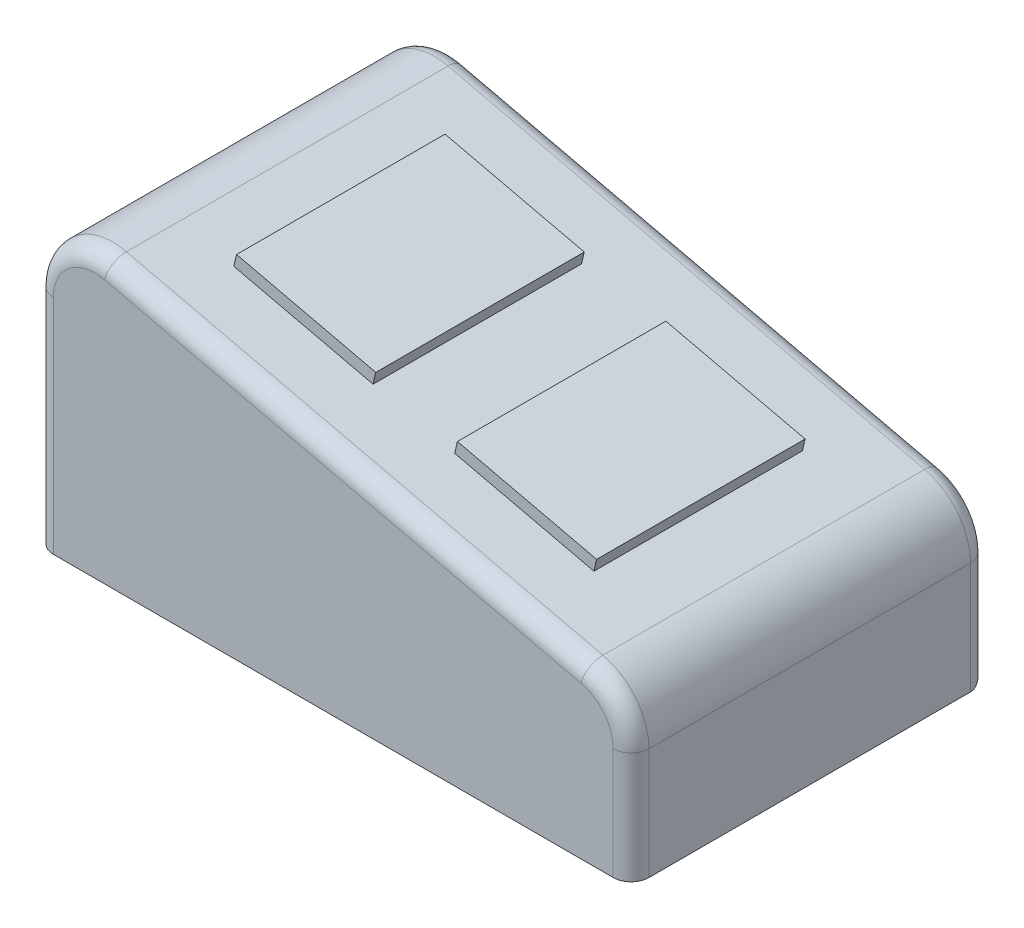
ISO-10303-21;
HEADER;
FILE_DESCRIPTION(('STEP AP214'),'2;1');
FILE_NAME('part.step','',(''),(''),'','','');
FILE_SCHEMA(('AUTOMOTIVE_DESIGN { 1 0 10303 214 1 1 1 1 }'));
ENDSEC;
DATA;
#1=APPLICATION_CONTEXT('core data for automotive mechanical design processes');
#2=APPLICATION_PROTOCOL_DEFINITION('international standard','automotive_design',2000,#1);
#3=PRODUCT_CONTEXT('',#1,'mechanical');
#4=PRODUCT('Part','Part','',(#3));
#5=PRODUCT_RELATED_PRODUCT_CATEGORY('part','',(#4));
#6=PRODUCT_DEFINITION_FORMATION('','',#4);
#7=PRODUCT_DEFINITION_CONTEXT('part definition',#1,'design');
#8=PRODUCT_DEFINITION('design','',#6,#7);
#9=PRODUCT_DEFINITION_SHAPE('','',#8);
#10=(LENGTH_UNIT() NAMED_UNIT(*) SI_UNIT(.MILLI.,.METRE.));
#11=(NAMED_UNIT(*) PLANE_ANGLE_UNIT() SI_UNIT($,.RADIAN.));
#12=(NAMED_UNIT(*) SI_UNIT($,.STERADIAN.) SOLID_ANGLE_UNIT());
#13=UNCERTAINTY_MEASURE_WITH_UNIT(LENGTH_MEASURE(1.E-05),#10,'distance_accuracy_value','');
#14=(GEOMETRIC_REPRESENTATION_CONTEXT(3) GLOBAL_UNCERTAINTY_ASSIGNED_CONTEXT((#13)) GLOBAL_UNIT_ASSIGNED_CONTEXT((#10,
#11,#12)) REPRESENTATION_CONTEXT('',''));
#15=CARTESIAN_POINT('',(0.,0.,0.));
#16=DIRECTION('',(0.,0.,1.));
#17=DIRECTION('',(1.,0.,0.));
#18=AXIS2_PLACEMENT_3D('',#15,#16,#17);
#19=CARTESIAN_POINT('',(-54.7441180352743,4.20563201299211,-60.));
#20=DIRECTION('',(0.227158877100831,0.973857712684091,0.));
#21=DIRECTION('',(-0.973857712684091,0.227158877100831,0.));
#22=AXIS2_PLACEMENT_3D('',#19,#20,#21);
#23=PLANE('',#22);
#24=DIRECTION('',(0.,0.,1.));
#25=VECTOR('',#24,1.);
#26=CARTESIAN_POINT('',(-54.7441180352743,4.20563201299211,-60.));
#27=LINE('',#26,#25);
#28=CARTESIAN_POINT('',(-54.7441180352743,4.20563201299211,-57.));
#29=VERTEX_POINT('',#28);
#30=CARTESIAN_POINT('',(-54.7441180352743,4.20563201299211,-3.));
#31=VERTEX_POINT('',#30);
#32=EDGE_CURVE('E246',#29,#31,#27,.T.);
#33=ORIENTED_EDGE('',*,*,#32,.T.);
#34=DIRECTION('',(-0.973857712684091,0.227158877100831,0.));
#35=VECTOR('',#34,1.);
#36=CARTESIAN_POINT('',(-54.7441180352743,4.20563201299211,-3.));
#37=LINE('',#36,#35);
#38=CARTESIAN_POINT('',(25.2558819647255,-14.454907336211,-3.));
#39=VERTEX_POINT('',#38);
#40=EDGE_CURVE('E280',#31,#39,#37,.F.);
#41=ORIENTED_EDGE('',*,*,#40,.T.);
#42=DIRECTION('',(0.,0.,1.));
#43=VECTOR('',#42,1.);
#44=CARTESIAN_POINT('',(25.2558819647255,-14.454907336211,-60.));
#45=LINE('',#44,#43);
#46=CARTESIAN_POINT('',(25.2558819647255,-14.454907336211,-57.));
#47=VERTEX_POINT('',#46);
#48=EDGE_CURVE('E249',#47,#39,#45,.T.);
#49=ORIENTED_EDGE('',*,*,#48,.F.);
#50=DIRECTION('',(-0.973857712684091,0.227158877100831,0.));
#51=VECTOR('',#50,1.);
#52=CARTESIAN_POINT('',(-54.7441180352743,4.20563201299211,-57.));
#53=LINE('',#52,#51);
#54=EDGE_CURVE('E278',#47,#29,#53,.T.);
#55=ORIENTED_EDGE('',*,*,#54,.T.);
#56=EDGE_LOOP('',(#33,#41,#49,#55));
#57=FACE_BOUND('',#56,.T.);
#58=DIRECTION('',(0.973857712684091,-0.227158877100831,0.));
#59=VECTOR('',#58,1.);
#60=CARTESIAN_POINT('',(-45.7103974646014,2.09845578575776,-12.));
#61=LINE('',#60,#59);
#62=CARTESIAN_POINT('',(-45.7103974646014,2.09845578575776,-12.));
#63=VERTEX_POINT('',#62);
#64=CARTESIAN_POINT('',(-22.3378123601832,-3.35335726466218,-12.));
#65=VERTEX_POINT('',#64);
#66=EDGE_CURVE('E201',#63,#65,#61,.T.);
#67=ORIENTED_EDGE('',*,*,#66,.F.);
#68=DIRECTION('',(0.,0.,1.));
#69=VECTOR('',#68,1.);
#70=CARTESIAN_POINT('',(-45.7103974646014,2.09845578575776,-47.));
#71=LINE('',#70,#69);
#72=CARTESIAN_POINT('',(-45.7103974646014,2.09845578575776,-47.));
#73=VERTEX_POINT('',#72);
#74=EDGE_CURVE('E198',#73,#63,#71,.T.);
#75=ORIENTED_EDGE('',*,*,#74,.F.);
#76=DIRECTION('',(-0.973857712684091,0.227158877100831,0.));
#77=VECTOR('',#76,1.);
#78=CARTESIAN_POINT('',(-45.7103974646014,2.09845578575776,-47.));
#79=LINE('',#78,#77);
#80=CARTESIAN_POINT('',(-22.3378123601832,-3.35335726466218,-47.));
#81=VERTEX_POINT('',#80);
#82=EDGE_CURVE('E211',#81,#73,#79,.T.);
#83=ORIENTED_EDGE('',*,*,#82,.F.);
#84=DIRECTION('',(0.,0.,-1.));
#85=VECTOR('',#84,1.);
#86=CARTESIAN_POINT('',(-22.3378123601832,-3.35335726466218,-47.));
#87=LINE('',#86,#85);
#88=EDGE_CURVE('E219',#65,#81,#87,.T.);
#89=ORIENTED_EDGE('',*,*,#88,.F.);
#90=EDGE_LOOP('',(#67,#75,#83,#89));
#91=FACE_BOUND('',#90,.T.);
#92=DIRECTION('',(0.973857712684091,-0.227158877100831,0.));
#93=VECTOR('',#92,1.);
#94=CARTESIAN_POINT('',(-8.62951617908137,-6.55090976838696,-12.));
#95=LINE('',#94,#93);
#96=CARTESIAN_POINT('',(-8.62951617908137,-6.55090976838696,-12.));
#97=VERTEX_POINT('',#96);
#98=CARTESIAN_POINT('',(14.7430689253368,-12.0027228188069,-12.));
#99=VERTEX_POINT('',#98);
#100=EDGE_CURVE('E655',#97,#99,#95,.T.);
#101=ORIENTED_EDGE('',*,*,#100,.F.);
#102=DIRECTION('',(0.,0.,1.));
#103=VECTOR('',#102,1.);
#104=CARTESIAN_POINT('',(-8.62951617908137,-6.55090976838696,-47.));
#105=LINE('',#104,#103);
#106=CARTESIAN_POINT('',(-8.62951617908137,-6.55090976838696,-47.));
#107=VERTEX_POINT('',#106);
#108=EDGE_CURVE('E196',#107,#97,#105,.T.);
#109=ORIENTED_EDGE('',*,*,#108,.F.);
#110=DIRECTION('',(-0.973857712684091,0.227158877100831,0.));
#111=VECTOR('',#110,1.);
#112=CARTESIAN_POINT('',(-8.62951617908137,-6.55090976838696,-47.));
#113=LINE('',#112,#111);
#114=CARTESIAN_POINT('',(14.7430689253368,-12.0027228188069,-47.));
#115=VERTEX_POINT('',#114);
#116=EDGE_CURVE('E192',#115,#107,#113,.T.);
#117=ORIENTED_EDGE('',*,*,#116,.F.);
#118=DIRECTION('',(0.,0.,-1.));
#119=VECTOR('',#118,1.);
#120=CARTESIAN_POINT('',(14.7430689253368,-12.0027228188069,-47.));
#121=LINE('',#120,#119);
#122=EDGE_CURVE('E658',#99,#115,#121,.T.);
#123=ORIENTED_EDGE('',*,*,#122,.F.);
#124=EDGE_LOOP('',(#101,#109,#117,#123));
#125=FACE_BOUND('',#124,.T.);
#126=ADVANCED_FACE('F35',(#57,#91,#125),#23,.T.);
#127=CARTESIAN_POINT('',(32.9842931937173,-24.193484463052,-60.));
#128=DIRECTION('',(1.,0.,0.));
#129=DIRECTION('',(0.,1.,0.));
#130=AXIS2_PLACEMENT_3D('',#127,#128,#129);
#131=PLANE('',#130);
#132=DIRECTION('',(0.,0.,1.));
#133=VECTOR('',#132,1.);
#134=CARTESIAN_POINT('',(32.9842931937173,-42.9319371727749,-60.));
#135=LINE('',#134,#133);
#136=CARTESIAN_POINT('',(32.9842931937173,-42.9319371727749,-57.));
#137=VERTEX_POINT('',#136);
#138=CARTESIAN_POINT('',(32.9842931937173,-42.9319371727749,-3.));
#139=VERTEX_POINT('',#138);
#140=EDGE_CURVE('E236',#137,#139,#135,.T.);
#141=ORIENTED_EDGE('',*,*,#140,.F.);
#142=DIRECTION('',(0.,1.,0.));
#143=VECTOR('',#142,1.);
#144=CARTESIAN_POINT('',(32.9842931937173,-24.193484463052,-57.));
#145=LINE('',#144,#143);
#146=CARTESIAN_POINT('',(32.9842931937173,-24.193484463052,-57.));
#147=VERTEX_POINT('',#146);
#148=EDGE_CURVE('E11',#137,#147,#145,.T.);
#149=ORIENTED_EDGE('',*,*,#148,.T.);
#150=DIRECTION('',(0.,0.,1.));
#151=VECTOR('',#150,1.);
#152=CARTESIAN_POINT('',(32.9842931937173,-24.193484463052,-60.));
#153=LINE('',#152,#151);
#154=CARTESIAN_POINT('',(32.9842931937173,-24.193484463052,-3.));
#155=VERTEX_POINT('',#154);
#156=EDGE_CURVE('E235',#147,#155,#153,.T.);
#157=ORIENTED_EDGE('',*,*,#156,.T.);
#158=DIRECTION('',(0.,1.,0.));
#159=VECTOR('',#158,1.);
#160=CARTESIAN_POINT('',(32.9842931937173,-24.193484463052,-3.));
#161=LINE('',#160,#159);
#162=EDGE_CURVE('E44',#155,#139,#161,.F.);
#163=ORIENTED_EDGE('',*,*,#162,.T.);
#164=EDGE_LOOP('',(#141,#149,#157,#163));
#165=FACE_BOUND('',#164,.T.);
#166=ADVANCED_FACE('F344',(#165),#131,.T.);
#167=CARTESIAN_POINT('',(-67.0157068062827,-42.9319371727749,-60.));
#168=DIRECTION('',(0.,-1.,0.));
#169=DIRECTION('',(0.,0.,-1.));
#170=AXIS2_PLACEMENT_3D('',#167,#168,#169);
#171=PLANE('',#170);
#172=DIRECTION('',(1.,0.,0.));
#173=VECTOR('',#172,1.);
#174=CARTESIAN_POINT('',(-67.0157068062827,-42.9319371727749,0.));
#175=LINE('',#174,#173);
#176=CARTESIAN_POINT('',(-64.0157068062827,-42.9319371727749,0.));
#177=VERTEX_POINT('',#176);
#178=CARTESIAN_POINT('',(29.9842931937173,-42.9319371727749,0.));
#179=VERTEX_POINT('',#178);
#180=EDGE_CURVE('E232',#177,#179,#175,.T.);
#181=ORIENTED_EDGE('',*,*,#180,.F.);
#182=CARTESIAN_POINT('',(-64.0157068062827,-42.9319371727749,-3.));
#183=DIRECTION('',(0.,-1.,0.));
#184=DIRECTION('',(0.,0.,-1.));
#185=AXIS2_PLACEMENT_3D('',#182,#183,#184);
#186=CIRCLE('',#185,3.);
#187=CARTESIAN_POINT('',(-67.0157068062827,-42.9319371727749,-3.));
#188=VERTEX_POINT('',#187);
#189=EDGE_CURVE('E268',#177,#188,#186,.T.);
#190=ORIENTED_EDGE('',*,*,#189,.T.);
#191=DIRECTION('',(0.,0.,1.));
#192=VECTOR('',#191,1.);
#193=CARTESIAN_POINT('',(-67.0157068062827,-42.9319371727749,-60.));
#194=LINE('',#193,#192);
#195=CARTESIAN_POINT('',(-67.0157068062827,-42.9319371727749,-57.));
#196=VERTEX_POINT('',#195);
#197=EDGE_CURVE('E240',#196,#188,#194,.T.);
#198=ORIENTED_EDGE('',*,*,#197,.F.);
#199=DIRECTION('',(1.,0.,0.));
#200=VECTOR('',#199,1.);
#201=CARTESIAN_POINT('',(32.9842931937173,-42.9319371727749,-57.));
#202=LINE('',#201,#200);
#203=EDGE_CURVE('E266',#196,#137,#202,.T.);
#204=ORIENTED_EDGE('',*,*,#203,.T.);
#205=ORIENTED_EDGE('',*,*,#140,.T.);
#206=CARTESIAN_POINT('',(29.9842931937173,-42.9319371727749,-3.));
#207=DIRECTION('',(0.,-1.,0.));
#208=DIRECTION('',(0.,0.,-1.));
#209=AXIS2_PLACEMENT_3D('',#206,#207,#208);
#210=CIRCLE('',#209,3.);
#211=EDGE_CURVE('E264',#139,#179,#210,.T.);
#212=ORIENTED_EDGE('',*,*,#211,.T.);
#213=EDGE_LOOP('',(#181,#190,#198,#204,#205,#212));
#214=FACE_BOUND('',#213,.T.);
#215=ADVANCED_FACE('F370',(#214),#171,.T.);
#216=CARTESIAN_POINT('',(-67.0157068062827,-5.53294511384887,-60.));
#217=DIRECTION('',(-1.,0.,0.));
#218=DIRECTION('',(0.,-1.,0.));
#219=AXIS2_PLACEMENT_3D('',#216,#217,#218);
#220=PLANE('',#219);
#221=ORIENTED_EDGE('',*,*,#197,.T.);
#222=DIRECTION('',(0.,-1.,0.));
#223=VECTOR('',#222,1.);
#224=CARTESIAN_POINT('',(-67.0157068062827,-5.53294511384887,-3.));
#225=LINE('',#224,#223);
#226=CARTESIAN_POINT('',(-67.0157068062827,-5.53294511384887,-3.));
#227=VERTEX_POINT('',#226);
#228=EDGE_CURVE('E272',#188,#227,#225,.F.);
#229=ORIENTED_EDGE('',*,*,#228,.T.);
#230=DIRECTION('',(0.,0.,1.));
#231=VECTOR('',#230,1.);
#232=CARTESIAN_POINT('',(-67.0157068062827,-5.53294511384887,-60.));
#233=LINE('',#232,#231);
#234=CARTESIAN_POINT('',(-67.0157068062827,-5.53294511384887,-57.));
#235=VERTEX_POINT('',#234);
#236=EDGE_CURVE('E243',#235,#227,#233,.T.);
#237=ORIENTED_EDGE('',*,*,#236,.F.);
#238=DIRECTION('',(0.,-1.,0.));
#239=VECTOR('',#238,1.);
#240=CARTESIAN_POINT('',(-67.0157068062827,-42.9319371727749,-57.));
#241=LINE('',#240,#239);
#242=EDGE_CURVE('E270',#235,#196,#241,.T.);
#243=ORIENTED_EDGE('',*,*,#242,.T.);
#244=EDGE_LOOP('',(#221,#229,#237,#243));
#245=FACE_BOUND('',#244,.T.);
#246=ADVANCED_FACE('F374',(#245),#220,.T.);
#247=CARTESIAN_POINT('',(-57.0157068062827,-5.53294511384879,-60.));
#248=DIRECTION('',(0.,0.,1.));
#249=DIRECTION('',(1.,0.,0.));
#250=AXIS2_PLACEMENT_3D('',#247,#248,#249);
#251=CYLINDRICAL_SURFACE('',#250,10.);
#252=ORIENTED_EDGE('',*,*,#236,.T.);
#253=CARTESIAN_POINT('',(-57.0157068062827,-5.53294511384879,-3.));
#254=DIRECTION('',(0.,0.,1.));
#255=DIRECTION('',(1.,0.,0.));
#256=AXIS2_PLACEMENT_3D('',#253,#254,#255);
#257=CIRCLE('',#256,10.);
#258=EDGE_CURVE('E276',#227,#31,#257,.F.);
#259=ORIENTED_EDGE('',*,*,#258,.T.);
#260=ORIENTED_EDGE('',*,*,#32,.F.);
#261=CARTESIAN_POINT('',(-57.0157068062827,-5.53294511384879,-57.));
#262=DIRECTION('',(0.,0.,1.));
#263=DIRECTION('',(1.,0.,0.));
#264=AXIS2_PLACEMENT_3D('',#261,#262,#263);
#265=CIRCLE('',#264,10.);
#266=EDGE_CURVE('E274',#29,#235,#265,.T.);
#267=ORIENTED_EDGE('',*,*,#266,.T.);
#268=EDGE_LOOP('',(#252,#259,#260,#267));
#269=FACE_BOUND('',#268,.T.);
#270=ADVANCED_FACE('F384',(#269),#251,.T.);
#271=CARTESIAN_POINT('',(22.9842931937173,-24.1934844630519,-60.));
#272=DIRECTION('',(0.,0.,1.));
#273=DIRECTION('',(1.,0.,0.));
#274=AXIS2_PLACEMENT_3D('',#271,#272,#273);
#275=CYLINDRICAL_SURFACE('',#274,10.);
#276=ORIENTED_EDGE('',*,*,#48,.T.);
#277=CARTESIAN_POINT('',(22.9842931937173,-24.1934844630519,-3.));
#278=DIRECTION('',(0.,0.,1.));
#279=DIRECTION('',(1.,0.,0.));
#280=AXIS2_PLACEMENT_3D('',#277,#278,#279);
#281=CIRCLE('',#280,10.);
#282=EDGE_CURVE('E285',#39,#155,#281,.F.);
#283=ORIENTED_EDGE('',*,*,#282,.T.);
#284=ORIENTED_EDGE('',*,*,#156,.F.);
#285=CARTESIAN_POINT('',(22.9842931937173,-24.1934844630519,-57.));
#286=DIRECTION('',(0.,0.,1.));
#287=DIRECTION('',(1.,0.,0.));
#288=AXIS2_PLACEMENT_3D('',#285,#286,#287);
#289=CIRCLE('',#288,10.);
#290=EDGE_CURVE('E282',#147,#47,#289,.T.);
#291=ORIENTED_EDGE('',*,*,#290,.T.);
#292=EDGE_LOOP('',(#276,#283,#284,#291));
#293=FACE_BOUND('',#292,.T.);
#294=ADVANCED_FACE('F347',(#293),#275,.T.);
#295=CARTESIAN_POINT('',(-57.0157068062827,-5.53294511384879,-60.));
#296=DIRECTION('',(0.,0.,1.));
#297=DIRECTION('',(1.,0.,0.));
#298=AXIS2_PLACEMENT_3D('',#295,#296,#297);
#299=PLANE('',#298);
#300=DIRECTION('',(-0.973857712684091,0.227158877100831,0.));
#301=VECTOR('',#300,1.);
#302=CARTESIAN_POINT('',(24.574405333423,-17.3764804742633,-60.));
#303=LINE('',#302,#301);
#304=CARTESIAN_POINT('',(-55.4255946665768,1.28405887493983,-60.));
#305=VERTEX_POINT('',#304);
#306=CARTESIAN_POINT('',(24.574405333423,-17.3764804742633,-60.));
#307=VERTEX_POINT('',#306);
#308=EDGE_CURVE('E52',#305,#307,#303,.F.);
#309=ORIENTED_EDGE('',*,*,#308,.T.);
#310=CARTESIAN_POINT('',(22.9842931937173,-24.1934844630519,-60.));
#311=DIRECTION('',(0.,0.,1.));
#312=DIRECTION('',(1.,0.,0.));
#313=AXIS2_PLACEMENT_3D('',#310,#311,#312);
#314=CIRCLE('',#313,7.);
#315=CARTESIAN_POINT('',(29.9842931937173,-24.193484463052,-60.));
#316=VERTEX_POINT('',#315);
#317=EDGE_CURVE('E295',#307,#316,#314,.F.);
#318=ORIENTED_EDGE('',*,*,#317,.T.);
#319=DIRECTION('',(0.,1.,0.));
#320=VECTOR('',#319,1.);
#321=CARTESIAN_POINT('',(29.9842931937173,-42.9319371727749,-60.));
#322=LINE('',#321,#320);
#323=CARTESIAN_POINT('',(29.9842931937173,-39.9319371727749,-60.));
#324=VERTEX_POINT('',#323);
#325=EDGE_CURVE('E287',#316,#324,#322,.F.);
#326=ORIENTED_EDGE('',*,*,#325,.T.);
#327=DIRECTION('',(1.,0.,0.));
#328=VECTOR('',#327,1.);
#329=CARTESIAN_POINT('',(-67.0157068062827,-39.9319371727749,-60.));
#330=LINE('',#329,#328);
#331=CARTESIAN_POINT('',(-64.0157068062827,-39.9319371727749,-60.));
#332=VERTEX_POINT('',#331);
#333=EDGE_CURVE('E289',#324,#332,#330,.F.);
#334=ORIENTED_EDGE('',*,*,#333,.T.);
#335=DIRECTION('',(0.,-1.,0.));
#336=VECTOR('',#335,1.);
#337=CARTESIAN_POINT('',(-64.0157068062827,-5.53294511384887,-60.));
#338=LINE('',#337,#336);
#339=CARTESIAN_POINT('',(-64.0157068062827,-5.53294511384885,-60.));
#340=VERTEX_POINT('',#339);
#341=EDGE_CURVE('E291',#332,#340,#338,.F.);
#342=ORIENTED_EDGE('',*,*,#341,.T.);
#343=CARTESIAN_POINT('',(-57.0157068062827,-5.53294511384879,-60.));
#344=DIRECTION('',(0.,0.,1.));
#345=DIRECTION('',(1.,0.,0.));
#346=AXIS2_PLACEMENT_3D('',#343,#344,#345);
#347=CIRCLE('',#346,7.);
#348=EDGE_CURVE('E57',#340,#305,#347,.F.);
#349=ORIENTED_EDGE('',*,*,#348,.T.);
#350=EDGE_LOOP('',(#309,#318,#326,#334,#342,#349));
#351=FACE_BOUND('',#350,.T.);
#352=ADVANCED_FACE('F334',(#351),#299,.F.);
#353=CARTESIAN_POINT('',(-57.0157068062827,-5.53294511384879,0.));
#354=DIRECTION('',(0.,0.,1.));
#355=DIRECTION('',(1.,0.,0.));
#356=AXIS2_PLACEMENT_3D('',#353,#354,#355);
#357=PLANE('',#356);
#358=CARTESIAN_POINT('',(-57.0157068062827,-5.53294511384879,0.));
#359=DIRECTION('',(0.,0.,1.));
#360=DIRECTION('',(1.,0.,0.));
#361=AXIS2_PLACEMENT_3D('',#358,#359,#360);
#362=CIRCLE('',#361,7.);
#363=CARTESIAN_POINT('',(-55.4255946665768,1.28405887493984,0.));
#364=VERTEX_POINT('',#363);
#365=CARTESIAN_POINT('',(-64.0157068062827,-5.53294511384887,0.));
#366=VERTEX_POINT('',#365);
#367=EDGE_CURVE('E259',#364,#366,#362,.T.);
#368=ORIENTED_EDGE('',*,*,#367,.T.);
#369=DIRECTION('',(0.,-1.,0.));
#370=VECTOR('',#369,1.);
#371=CARTESIAN_POINT('',(-64.0157068062827,-5.53294511384878,0.));
#372=LINE('',#371,#370);
#373=EDGE_CURVE('E261',#366,#177,#372,.T.);
#374=ORIENTED_EDGE('',*,*,#373,.T.);
#375=ORIENTED_EDGE('',*,*,#180,.T.);
#376=DIRECTION('',(0.,1.,0.));
#377=VECTOR('',#376,1.);
#378=CARTESIAN_POINT('',(29.9842931937173,-5.53294511384875,0.));
#379=LINE('',#378,#377);
#380=CARTESIAN_POINT('',(29.9842931937173,-24.193484463052,0.));
#381=VERTEX_POINT('',#380);
#382=EDGE_CURVE('E239',#179,#381,#379,.T.);
#383=ORIENTED_EDGE('',*,*,#382,.T.);
#384=CARTESIAN_POINT('',(22.9842931937173,-24.1934844630519,0.));
#385=DIRECTION('',(0.,0.,1.));
#386=DIRECTION('',(1.,0.,0.));
#387=AXIS2_PLACEMENT_3D('',#384,#385,#386);
#388=CIRCLE('',#387,7.);
#389=CARTESIAN_POINT('',(24.574405333423,-17.3764804742633,0.));
#390=VERTEX_POINT('',#389);
#391=EDGE_CURVE('E255',#381,#390,#388,.T.);
#392=ORIENTED_EDGE('',*,*,#391,.T.);
#393=DIRECTION('',(-0.973857712684091,0.227158877100831,0.));
#394=VECTOR('',#393,1.);
#395=CARTESIAN_POINT('',(-55.4255946665769,1.28405887493986,0.));
#396=LINE('',#395,#394);
#397=EDGE_CURVE('E257',#390,#364,#396,.T.);
#398=ORIENTED_EDGE('',*,*,#397,.T.);
#399=EDGE_LOOP('',(#368,#374,#375,#383,#392,#398));
#400=FACE_BOUND('',#399,.T.);
#401=ADVANCED_FACE('F362',(#400),#357,.T.);
#402=CARTESIAN_POINT('',(-45.2560797103997,4.04617121112594,-47.));
#403=DIRECTION('',(0.973857712684091,-0.227158877100831,0.));
#404=DIRECTION('',(0.227158877100831,0.973857712684091,0.));
#405=AXIS2_PLACEMENT_3D('',#402,#403,#404);
#406=PLANE('',#405);
#407=ORIENTED_EDGE('',*,*,#74,.T.);
#408=DIRECTION('',(-0.227158877100831,-0.973857712684091,0.));
#409=VECTOR('',#408,1.);
#410=CARTESIAN_POINT('',(-45.2560797103997,4.04617121112594,-12.));
#411=LINE('',#410,#409);
#412=CARTESIAN_POINT('',(-45.2560797103997,4.04617121112594,-12.));
#413=VERTEX_POINT('',#412);
#414=EDGE_CURVE('E230',#413,#63,#411,.T.);
#415=ORIENTED_EDGE('',*,*,#414,.F.);
#416=DIRECTION('',(0.,0.,1.));
#417=VECTOR('',#416,1.);
#418=CARTESIAN_POINT('',(-45.2560797103997,4.04617121112594,-47.));
#419=LINE('',#418,#417);
#420=CARTESIAN_POINT('',(-45.2560797103997,4.04617121112594,-47.));
#421=VERTEX_POINT('',#420);
#422=EDGE_CURVE('E207',#421,#413,#419,.T.);
#423=ORIENTED_EDGE('',*,*,#422,.F.);
#424=DIRECTION('',(-0.227158877100831,-0.973857712684091,0.));
#425=VECTOR('',#424,1.);
#426=CARTESIAN_POINT('',(-45.2560797103997,4.04617121112594,-47.));
#427=LINE('',#426,#425);
#428=EDGE_CURVE('E216',#421,#73,#427,.T.);
#429=ORIENTED_EDGE('',*,*,#428,.T.);
#430=EDGE_LOOP('',(#407,#415,#423,#429));
#431=FACE_BOUND('',#430,.T.);
#432=ADVANCED_FACE('F559',(#431),#406,.F.);
#433=CARTESIAN_POINT('',(-45.2560797103997,4.04617121112594,-12.));
#434=DIRECTION('',(0.,0.,-1.));
#435=DIRECTION('',(-1.,0.,0.));
#436=AXIS2_PLACEMENT_3D('',#433,#434,#435);
#437=PLANE('',#436);
#438=ORIENTED_EDGE('',*,*,#66,.T.);
#439=DIRECTION('',(-0.227158877100831,-0.973857712684091,0.));
#440=VECTOR('',#439,1.);
#441=CARTESIAN_POINT('',(-21.8834946059815,-1.405641839294,-12.));
#442=LINE('',#441,#440);
#443=CARTESIAN_POINT('',(-21.8834946059815,-1.405641839294,-12.));
#444=VERTEX_POINT('',#443);
#445=EDGE_CURVE('E227',#444,#65,#442,.T.);
#446=ORIENTED_EDGE('',*,*,#445,.F.);
#447=DIRECTION('',(0.973857712684091,-0.227158877100831,0.));
#448=VECTOR('',#447,1.);
#449=CARTESIAN_POINT('',(-45.2560797103997,4.04617121112594,-12.));
#450=LINE('',#449,#448);
#451=EDGE_CURVE('E210',#413,#444,#450,.T.);
#452=ORIENTED_EDGE('',*,*,#451,.F.);
#453=ORIENTED_EDGE('',*,*,#414,.T.);
#454=EDGE_LOOP('',(#438,#446,#452,#453));
#455=FACE_BOUND('',#454,.T.);
#456=ADVANCED_FACE('F550',(#455),#437,.F.);
#457=CARTESIAN_POINT('',(-21.8834946059816,-1.405641839294,-47.));
#458=DIRECTION('',(-0.973857712684091,0.227158877100831,0.));
#459=DIRECTION('',(-0.227158877100831,-0.973857712684091,0.));
#460=AXIS2_PLACEMENT_3D('',#457,#458,#459);
#461=PLANE('',#460);
#462=ORIENTED_EDGE('',*,*,#88,.T.);
#463=DIRECTION('',(-0.227158877100831,-0.973857712684091,0.));
#464=VECTOR('',#463,1.);
#465=CARTESIAN_POINT('',(-21.8834946059816,-1.405641839294,-47.));
#466=LINE('',#465,#464);
#467=CARTESIAN_POINT('',(-21.8834946059816,-1.405641839294,-47.));
#468=VERTEX_POINT('',#467);
#469=EDGE_CURVE('E225',#468,#81,#466,.T.);
#470=ORIENTED_EDGE('',*,*,#469,.F.);
#471=DIRECTION('',(0.,0.,-1.));
#472=VECTOR('',#471,1.);
#473=CARTESIAN_POINT('',(-21.8834946059816,-1.405641839294,-47.));
#474=LINE('',#473,#472);
#475=EDGE_CURVE('E213',#444,#468,#474,.T.);
#476=ORIENTED_EDGE('',*,*,#475,.F.);
#477=ORIENTED_EDGE('',*,*,#445,.T.);
#478=EDGE_LOOP('',(#462,#470,#476,#477));
#479=FACE_BOUND('',#478,.T.);
#480=ADVANCED_FACE('F541',(#479),#461,.F.);
#481=CARTESIAN_POINT('',(-45.2560797103997,4.04617121112594,-47.));
#482=DIRECTION('',(0.,0.,1.));
#483=DIRECTION('',(1.,0.,0.));
#484=AXIS2_PLACEMENT_3D('',#481,#482,#483);
#485=PLANE('',#484);
#486=ORIENTED_EDGE('',*,*,#82,.T.);
#487=ORIENTED_EDGE('',*,*,#428,.F.);
#488=DIRECTION('',(-0.973857712684091,0.227158877100831,0.));
#489=VECTOR('',#488,1.);
#490=CARTESIAN_POINT('',(-45.2560797103997,4.04617121112594,-47.));
#491=LINE('',#490,#489);
#492=EDGE_CURVE('E215',#468,#421,#491,.T.);
#493=ORIENTED_EDGE('',*,*,#492,.F.);
#494=ORIENTED_EDGE('',*,*,#469,.T.);
#495=EDGE_LOOP('',(#486,#487,#493,#494));
#496=FACE_BOUND('',#495,.T.);
#497=ADVANCED_FACE('F531',(#496),#485,.F.);
#498=CARTESIAN_POINT('',(-1.44017029119905,-6.17418506185051,0.));
#499=DIRECTION('',(0.227158877100831,0.973857712684091,0.));
#500=DIRECTION('',(-0.973857712684091,0.227158877100831,0.));
#501=AXIS2_PLACEMENT_3D('',#498,#499,#500);
#502=PLANE('',#501);
#503=ORIENTED_EDGE('',*,*,#422,.T.);
#504=ORIENTED_EDGE('',*,*,#451,.T.);
#505=ORIENTED_EDGE('',*,*,#475,.T.);
#506=ORIENTED_EDGE('',*,*,#492,.T.);
#507=EDGE_LOOP('',(#503,#504,#505,#506));
#508=FACE_BOUND('',#507,.T.);
#509=ADVANCED_FACE('F523',(#508),#502,.T.);
#510=CARTESIAN_POINT('',(-8.17519842487971,-4.60319434301877,-47.));
#511=DIRECTION('',(0.973857712684091,-0.227158877100831,0.));
#512=DIRECTION('',(0.227158877100831,0.973857712684091,0.));
#513=AXIS2_PLACEMENT_3D('',#510,#511,#512);
#514=PLANE('',#513);
#515=ORIENTED_EDGE('',*,*,#108,.T.);
#516=DIRECTION('',(-0.227158877100831,-0.973857712684091,0.));
#517=VECTOR('',#516,1.);
#518=CARTESIAN_POINT('',(-8.1751984248797,-4.60319434301877,-12.));
#519=LINE('',#518,#517);
#520=CARTESIAN_POINT('',(-8.1751984248797,-4.60319434301877,-12.));
#521=VERTEX_POINT('',#520);
#522=EDGE_CURVE('E176',#521,#97,#519,.T.);
#523=ORIENTED_EDGE('',*,*,#522,.F.);
#524=DIRECTION('',(0.,0.,1.));
#525=VECTOR('',#524,1.);
#526=CARTESIAN_POINT('',(-8.17519842487971,-4.60319434301877,-47.));
#527=LINE('',#526,#525);
#528=CARTESIAN_POINT('',(-8.17519842487971,-4.60319434301877,-47.));
#529=VERTEX_POINT('',#528);
#530=EDGE_CURVE('E183',#529,#521,#527,.T.);
#531=ORIENTED_EDGE('',*,*,#530,.F.);
#532=DIRECTION('',(-0.227158877100831,-0.973857712684091,0.));
#533=VECTOR('',#532,1.);
#534=CARTESIAN_POINT('',(-8.17519842487971,-4.60319434301877,-47.));
#535=LINE('',#534,#533);
#536=EDGE_CURVE('E665',#529,#107,#535,.T.);
#537=ORIENTED_EDGE('',*,*,#536,.T.);
#538=EDGE_LOOP('',(#515,#523,#531,#537));
#539=FACE_BOUND('',#538,.T.);
#540=ADVANCED_FACE('F194',(#539),#514,.F.);
#541=CARTESIAN_POINT('',(-8.1751984248797,-4.60319434301877,-12.));
#542=DIRECTION('',(0.,0.,-1.));
#543=DIRECTION('',(-1.,0.,0.));
#544=AXIS2_PLACEMENT_3D('',#541,#542,#543);
#545=PLANE('',#544);
#546=ORIENTED_EDGE('',*,*,#100,.T.);
#547=DIRECTION('',(-0.227158877100831,-0.973857712684091,0.));
#548=VECTOR('',#547,1.);
#549=CARTESIAN_POINT('',(15.1973866795385,-10.0550073934387,-12.));
#550=LINE('',#549,#548);
#551=CARTESIAN_POINT('',(15.1973866795385,-10.0550073934387,-12.));
#552=VERTEX_POINT('',#551);
#553=EDGE_CURVE('E179',#552,#99,#550,.T.);
#554=ORIENTED_EDGE('',*,*,#553,.F.);
#555=DIRECTION('',(0.973857712684091,-0.227158877100831,0.));
#556=VECTOR('',#555,1.);
#557=CARTESIAN_POINT('',(-8.1751984248797,-4.60319434301877,-12.));
#558=LINE('',#557,#556);
#559=EDGE_CURVE('E172',#521,#552,#558,.T.);
#560=ORIENTED_EDGE('',*,*,#559,.F.);
#561=ORIENTED_EDGE('',*,*,#522,.T.);
#562=EDGE_LOOP('',(#546,#554,#560,#561));
#563=FACE_BOUND('',#562,.T.);
#564=ADVANCED_FACE('F174',(#563),#545,.F.);
#565=CARTESIAN_POINT('',(15.1973866795385,-10.0550073934387,-47.));
#566=DIRECTION('',(-0.973857712684091,0.227158877100831,0.));
#567=DIRECTION('',(-0.227158877100831,-0.973857712684091,0.));
#568=AXIS2_PLACEMENT_3D('',#565,#566,#567);
#569=PLANE('',#568);
#570=ORIENTED_EDGE('',*,*,#122,.T.);
#571=DIRECTION('',(-0.227158877100831,-0.973857712684091,0.));
#572=VECTOR('',#571,1.);
#573=CARTESIAN_POINT('',(15.1973866795385,-10.0550073934387,-47.));
#574=LINE('',#573,#572);
#575=CARTESIAN_POINT('',(15.1973866795385,-10.0550073934387,-47.));
#576=VERTEX_POINT('',#575);
#577=EDGE_CURVE('E203',#576,#115,#574,.T.);
#578=ORIENTED_EDGE('',*,*,#577,.F.);
#579=DIRECTION('',(0.,0.,-1.));
#580=VECTOR('',#579,1.);
#581=CARTESIAN_POINT('',(15.1973866795385,-10.0550073934387,-47.));
#582=LINE('',#581,#580);
#583=EDGE_CURVE('E182',#552,#576,#582,.T.);
#584=ORIENTED_EDGE('',*,*,#583,.F.);
#585=ORIENTED_EDGE('',*,*,#553,.T.);
#586=EDGE_LOOP('',(#570,#578,#584,#585));
#587=FACE_BOUND('',#586,.T.);
#588=ADVANCED_FACE('F499',(#587),#569,.F.);
#589=CARTESIAN_POINT('',(-8.17519842487971,-4.60319434301877,-47.));
#590=DIRECTION('',(0.,0.,1.));
#591=DIRECTION('',(1.,0.,0.));
#592=AXIS2_PLACEMENT_3D('',#589,#590,#591);
#593=PLANE('',#592);
#594=ORIENTED_EDGE('',*,*,#116,.T.);
#595=ORIENTED_EDGE('',*,*,#536,.F.);
#596=DIRECTION('',(-0.973857712684091,0.227158877100831,0.));
#597=VECTOR('',#596,1.);
#598=CARTESIAN_POINT('',(-8.17519842487971,-4.60319434301877,-47.));
#599=LINE('',#598,#597);
#600=EDGE_CURVE('E188',#576,#529,#599,.T.);
#601=ORIENTED_EDGE('',*,*,#600,.F.);
#602=ORIENTED_EDGE('',*,*,#577,.T.);
#603=EDGE_LOOP('',(#594,#595,#601,#602));
#604=FACE_BOUND('',#603,.T.);
#605=ADVANCED_FACE('F490',(#604),#593,.F.);
#606=CARTESIAN_POINT('',(-1.44017029119905,-6.1741850618505,0.));
#607=DIRECTION('',(0.227158877100831,0.973857712684091,0.));
#608=DIRECTION('',(-0.973857712684091,0.227158877100831,0.));
#609=AXIS2_PLACEMENT_3D('',#606,#607,#608);
#610=PLANE('',#609);
#611=ORIENTED_EDGE('',*,*,#530,.T.);
#612=ORIENTED_EDGE('',*,*,#559,.T.);
#613=ORIENTED_EDGE('',*,*,#583,.T.);
#614=ORIENTED_EDGE('',*,*,#600,.T.);
#615=EDGE_LOOP('',(#611,#612,#613,#614));
#616=FACE_BOUND('',#615,.T.);
#617=ADVANCED_FACE('F186',(#616),#610,.T.);
#618=CARTESIAN_POINT('',(29.9842931937173,-5.53294511384875,-3.));
#619=DIRECTION('',(0.,1.,0.));
#620=DIRECTION('',(-1.,0.,0.));
#621=AXIS2_PLACEMENT_3D('',#618,#619,#620);
#622=CYLINDRICAL_SURFACE('',#621,3.);
#623=ORIENTED_EDGE('',*,*,#211,.F.);
#624=ORIENTED_EDGE('',*,*,#162,.F.);
#625=CARTESIAN_POINT('',(29.9842931937173,-24.193484463052,-3.));
#626=DIRECTION('',(0.,1.,0.));
#627=DIRECTION('',(-1.,0.,0.));
#628=AXIS2_PLACEMENT_3D('',#625,#626,#627);
#629=CIRCLE('',#628,3.);
#630=EDGE_CURVE('E307',#381,#155,#629,.T.);
#631=ORIENTED_EDGE('',*,*,#630,.F.);
#632=ORIENTED_EDGE('',*,*,#382,.F.);
#633=EDGE_LOOP('',(#623,#624,#631,#632));
#634=FACE_BOUND('',#633,.T.);
#635=ADVANCED_FACE('F368',(#634),#622,.T.);
#636=CARTESIAN_POINT('',(22.9842931937173,-24.1934844630519,-3.));
#637=DIRECTION('',(0.,0.,1.));
#638=DIRECTION('',(1.,0.,0.));
#639=AXIS2_PLACEMENT_3D('',#636,#637,#638);
#640=TOROIDAL_SURFACE('',#639,7.,3.);
#641=ORIENTED_EDGE('',*,*,#630,.T.);
#642=ORIENTED_EDGE('',*,*,#282,.F.);
#643=CARTESIAN_POINT('',(24.574405333423,-17.3764804742633,-3.));
#644=DIRECTION('',(-0.973857712684091,0.227158877100831,0.));
#645=DIRECTION('',(-0.227158877100831,-0.973857712684091,0.));
#646=AXIS2_PLACEMENT_3D('',#643,#644,#645);
#647=CIRCLE('',#646,3.);
#648=EDGE_CURVE('E304',#390,#39,#647,.T.);
#649=ORIENTED_EDGE('',*,*,#648,.F.);
#650=ORIENTED_EDGE('',*,*,#391,.F.);
#651=EDGE_LOOP('',(#641,#642,#649,#650));
#652=FACE_BOUND('',#651,.T.);
#653=ADVANCED_FACE('F352',(#652),#640,.T.);
#654=CARTESIAN_POINT('',(-55.4255946665769,1.28405887493986,-3.));
#655=DIRECTION('',(-0.973857712684091,0.227158877100831,0.));
#656=DIRECTION('',(-0.227158877100831,-0.973857712684091,0.));
#657=AXIS2_PLACEMENT_3D('',#654,#655,#656);
#658=CYLINDRICAL_SURFACE('',#657,3.);
#659=ORIENTED_EDGE('',*,*,#648,.T.);
#660=ORIENTED_EDGE('',*,*,#40,.F.);
#661=CARTESIAN_POINT('',(-55.4255946665768,1.28405887493984,-3.));
#662=DIRECTION('',(-0.973857712684089,0.227158877100839,0.));
#663=DIRECTION('',(-0.227158877100839,-0.973857712684089,0.));
#664=AXIS2_PLACEMENT_3D('',#661,#662,#663);
#665=CIRCLE('',#664,3.);
#666=EDGE_CURVE('E301',#364,#31,#665,.T.);
#667=ORIENTED_EDGE('',*,*,#666,.F.);
#668=ORIENTED_EDGE('',*,*,#397,.F.);
#669=EDGE_LOOP('',(#659,#660,#667,#668));
#670=FACE_BOUND('',#669,.T.);
#671=ADVANCED_FACE('F358',(#670),#658,.T.);
#672=CARTESIAN_POINT('',(-57.0157068062827,-5.53294511384879,-3.));
#673=DIRECTION('',(0.,0.,1.));
#674=DIRECTION('',(1.,0.,0.));
#675=AXIS2_PLACEMENT_3D('',#672,#673,#674);
#676=TOROIDAL_SURFACE('',#675,7.,3.);
#677=ORIENTED_EDGE('',*,*,#666,.T.);
#678=ORIENTED_EDGE('',*,*,#258,.F.);
#679=CARTESIAN_POINT('',(-64.0157068062827,-5.53294511384887,-3.));
#680=DIRECTION('',(0.,-1.,0.));
#681=DIRECTION('',(1.,0.,0.));
#682=AXIS2_PLACEMENT_3D('',#679,#680,#681);
#683=CIRCLE('',#682,3.);
#684=EDGE_CURVE('E298',#366,#227,#683,.T.);
#685=ORIENTED_EDGE('',*,*,#684,.F.);
#686=ORIENTED_EDGE('',*,*,#367,.F.);
#687=EDGE_LOOP('',(#677,#678,#685,#686));
#688=FACE_BOUND('',#687,.T.);
#689=ADVANCED_FACE('F381',(#688),#676,.T.);
#690=CARTESIAN_POINT('',(-64.0157068062827,-5.53294511384878,-3.));
#691=DIRECTION('',(0.,-1.,0.));
#692=DIRECTION('',(1.,0.,0.));
#693=AXIS2_PLACEMENT_3D('',#690,#691,#692);
#694=CYLINDRICAL_SURFACE('',#693,3.);
#695=ORIENTED_EDGE('',*,*,#684,.T.);
#696=ORIENTED_EDGE('',*,*,#228,.F.);
#697=ORIENTED_EDGE('',*,*,#189,.F.);
#698=ORIENTED_EDGE('',*,*,#373,.F.);
#699=EDGE_LOOP('',(#695,#696,#697,#698));
#700=FACE_BOUND('',#699,.T.);
#701=ADVANCED_FACE('F377',(#700),#694,.T.);
#702=CARTESIAN_POINT('',(-64.0157068062827,-5.53294511384887,-57.));
#703=DIRECTION('',(0.,1.,0.));
#704=DIRECTION('',(-1.,0.,0.));
#705=AXIS2_PLACEMENT_3D('',#702,#703,#704);
#706=CYLINDRICAL_SURFACE('',#705,3.);
#707=CARTESIAN_POINT('',(-64.0157068062827,-5.53294511384885,-57.));
#708=DIRECTION('',(0.,1.,0.));
#709=DIRECTION('',(-1.,0.,0.));
#710=AXIS2_PLACEMENT_3D('',#707,#708,#709);
#711=CIRCLE('',#710,3.);
#712=EDGE_CURVE('E319',#340,#235,#711,.T.);
#713=ORIENTED_EDGE('',*,*,#712,.F.);
#714=ORIENTED_EDGE('',*,*,#341,.F.);
#715=CARTESIAN_POINT('',(-64.0157068062827,-39.9319371727749,-57.));
#716=DIRECTION('',(-0.707106781186547,0.707106781186548,0.));
#717=DIRECTION('',(-0.707106781186548,-0.707106781186547,0.));
#718=AXIS2_PLACEMENT_3D('',#715,#716,#717);
#719=ELLIPSE('',#718,4.24264068711929,3.);
#720=EDGE_CURVE('E39',#196,#332,#719,.F.);
#721=ORIENTED_EDGE('',*,*,#720,.F.);
#722=ORIENTED_EDGE('',*,*,#242,.F.);
#723=EDGE_LOOP('',(#713,#714,#721,#722));
#724=FACE_BOUND('',#723,.T.);
#725=ADVANCED_FACE('F37',(#724),#706,.T.);
#726=CARTESIAN_POINT('',(-67.0157068062827,-39.9319371727749,-57.));
#727=DIRECTION('',(-1.,0.,0.));
#728=DIRECTION('',(0.,0.,1.));
#729=AXIS2_PLACEMENT_3D('',#726,#727,#728);
#730=CYLINDRICAL_SURFACE('',#729,3.);
#731=ORIENTED_EDGE('',*,*,#720,.T.);
#732=ORIENTED_EDGE('',*,*,#333,.F.);
#733=CARTESIAN_POINT('',(29.9842931937173,-39.9319371727749,-57.));
#734=DIRECTION('',(-0.707106781186547,-0.707106781186548,0.));
#735=DIRECTION('',(0.707106781186548,-0.707106781186547,0.));
#736=AXIS2_PLACEMENT_3D('',#733,#734,#735);
#737=ELLIPSE('',#736,4.24264068711929,3.);
#738=EDGE_CURVE('E317',#137,#324,#737,.F.);
#739=ORIENTED_EDGE('',*,*,#738,.F.);
#740=ORIENTED_EDGE('',*,*,#203,.F.);
#741=EDGE_LOOP('',(#731,#732,#739,#740));
#742=FACE_BOUND('',#741,.T.);
#743=ADVANCED_FACE('F329',(#742),#730,.T.);
#744=CARTESIAN_POINT('',(-57.0157068062827,-5.53294511384879,-57.));
#745=DIRECTION('',(0.,0.,1.));
#746=DIRECTION('',(1.,0.,0.));
#747=AXIS2_PLACEMENT_3D('',#744,#745,#746);
#748=TOROIDAL_SURFACE('',#747,7.,3.);
#749=ORIENTED_EDGE('',*,*,#712,.T.);
#750=ORIENTED_EDGE('',*,*,#266,.F.);
#751=CARTESIAN_POINT('',(-55.4255946665768,1.28405887493983,-57.));
#752=DIRECTION('',(0.973857712684091,-0.22715887710083,0.));
#753=DIRECTION('',(0.22715887710083,0.973857712684091,0.));
#754=AXIS2_PLACEMENT_3D('',#751,#752,#753);
#755=CIRCLE('',#754,3.);
#756=EDGE_CURVE('E314',#305,#29,#755,.T.);
#757=ORIENTED_EDGE('',*,*,#756,.F.);
#758=ORIENTED_EDGE('',*,*,#348,.F.);
#759=EDGE_LOOP('',(#749,#750,#757,#758));
#760=FACE_BOUND('',#759,.T.);
#761=ADVANCED_FACE('F391',(#760),#748,.T.);
#762=CARTESIAN_POINT('',(29.9842931937173,-24.193484463052,-57.));
#763=DIRECTION('',(0.,-1.,0.));
#764=DIRECTION('',(1.,0.,0.));
#765=AXIS2_PLACEMENT_3D('',#762,#763,#764);
#766=CYLINDRICAL_SURFACE('',#765,3.);
#767=ORIENTED_EDGE('',*,*,#738,.T.);
#768=ORIENTED_EDGE('',*,*,#325,.F.);
#769=CARTESIAN_POINT('',(29.9842931937173,-24.193484463052,-57.));
#770=DIRECTION('',(0.,1.,0.));
#771=DIRECTION('',(0.,0.,1.));
#772=AXIS2_PLACEMENT_3D('',#769,#770,#771);
#773=CIRCLE('',#772,3.);
#774=EDGE_CURVE('E312',#147,#316,#773,.T.);
#775=ORIENTED_EDGE('',*,*,#774,.F.);
#776=ORIENTED_EDGE('',*,*,#148,.F.);
#777=EDGE_LOOP('',(#767,#768,#775,#776));
#778=FACE_BOUND('',#777,.T.);
#779=ADVANCED_FACE('F338',(#778),#766,.T.);
#780=CARTESIAN_POINT('',(-55.4255946665768,1.28405887493984,-57.));
#781=DIRECTION('',(0.973857712684091,-0.227158877100831,0.));
#782=DIRECTION('',(0.227158877100831,0.973857712684091,0.));
#783=AXIS2_PLACEMENT_3D('',#780,#781,#782);
#784=CYLINDRICAL_SURFACE('',#783,3.);
#785=ORIENTED_EDGE('',*,*,#756,.T.);
#786=ORIENTED_EDGE('',*,*,#54,.F.);
#787=CARTESIAN_POINT('',(24.574405333423,-17.3764804742633,-57.));
#788=DIRECTION('',(0.973857712684092,-0.227158877100825,0.));
#789=DIRECTION('',(0.227158877100825,0.973857712684092,0.));
#790=AXIS2_PLACEMENT_3D('',#787,#788,#789);
#791=CIRCLE('',#790,3.);
#792=EDGE_CURVE('E310',#307,#47,#791,.T.);
#793=ORIENTED_EDGE('',*,*,#792,.F.);
#794=ORIENTED_EDGE('',*,*,#308,.F.);
#795=EDGE_LOOP('',(#785,#786,#793,#794));
#796=FACE_BOUND('',#795,.T.);
#797=ADVANCED_FACE('F390',(#796),#784,.T.);
#798=CARTESIAN_POINT('',(22.9842931937173,-24.1934844630519,-57.));
#799=DIRECTION('',(0.,0.,1.));
#800=DIRECTION('',(1.,0.,0.));
#801=AXIS2_PLACEMENT_3D('',#798,#799,#800);
#802=TOROIDAL_SURFACE('',#801,7.,3.);
#803=ORIENTED_EDGE('',*,*,#774,.T.);
#804=ORIENTED_EDGE('',*,*,#317,.F.);
#805=ORIENTED_EDGE('',*,*,#792,.T.);
#806=ORIENTED_EDGE('',*,*,#290,.F.);
#807=EDGE_LOOP('',(#803,#804,#805,#806));
#808=FACE_BOUND('',#807,.T.);
#809=ADVANCED_FACE('F420',(#808),#802,.T.);
#810=CLOSED_SHELL('',(#126,#166,#215,#246,#270,#294,#352,#401,#432,#456,#480,#497,#509,#540,
#564,#588,#605,#617,#635,#653,#671,#689,#701,#725,#743,#761,#779,#797,#809));
#811=MANIFOLD_SOLID_BREP('B2',#810);
#812=ADVANCED_BREP_SHAPE_REPRESENTATION('',(#18,#811),#14);
#813=SHAPE_DEFINITION_REPRESENTATION(#9,#812);
ENDSEC;
END-ISO-10303-21;
